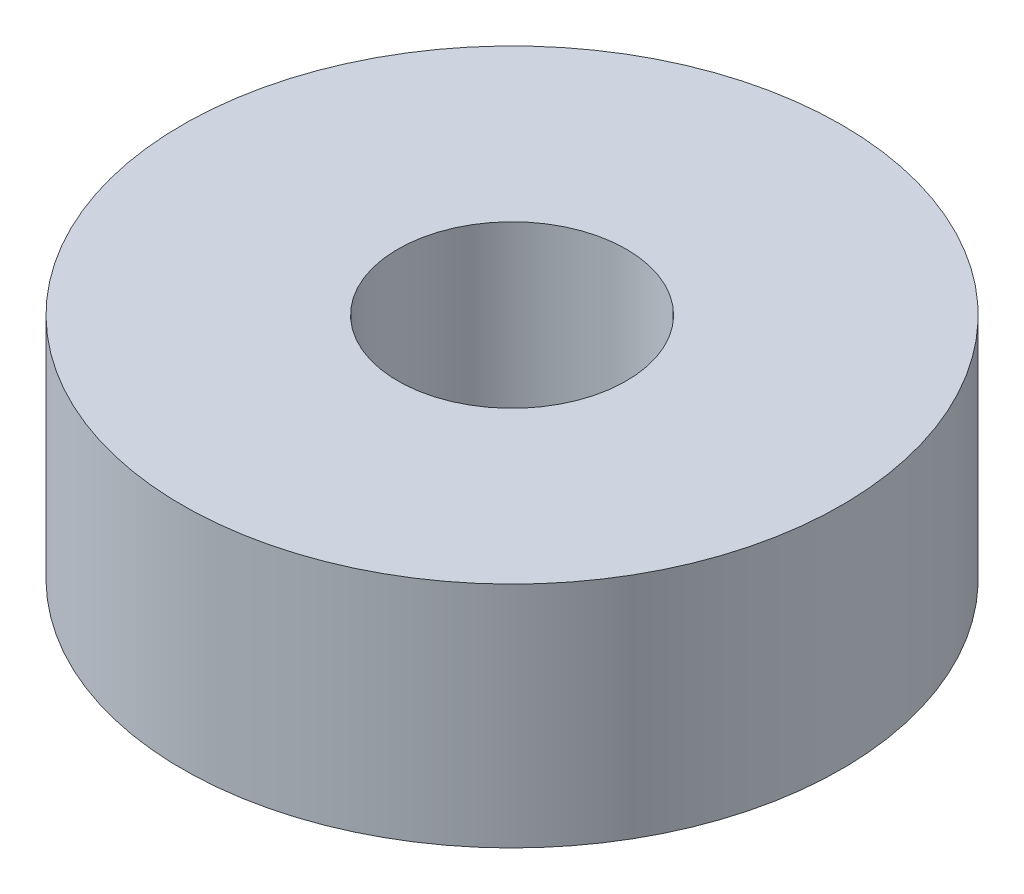
ISO-10303-21;
HEADER;
FILE_DESCRIPTION(('STEP AP214'),'2;1');
FILE_NAME('part.step','',(''),(''),'','','');
FILE_SCHEMA(('AUTOMOTIVE_DESIGN { 1 0 10303 214 1 1 1 1 }'));
ENDSEC;
DATA;
#1=APPLICATION_CONTEXT('core data for automotive mechanical design processes');
#2=APPLICATION_PROTOCOL_DEFINITION('international standard','automotive_design',2000,#1);
#3=PRODUCT_CONTEXT('',#1,'mechanical');
#4=PRODUCT('Part','Part','',(#3));
#5=PRODUCT_RELATED_PRODUCT_CATEGORY('part','',(#4));
#6=PRODUCT_DEFINITION_FORMATION('','',#4);
#7=PRODUCT_DEFINITION_CONTEXT('part definition',#1,'design');
#8=PRODUCT_DEFINITION('design','',#6,#7);
#9=PRODUCT_DEFINITION_SHAPE('','',#8);
#10=(LENGTH_UNIT() NAMED_UNIT(*) SI_UNIT(.MILLI.,.METRE.));
#11=(NAMED_UNIT(*) PLANE_ANGLE_UNIT() SI_UNIT($,.RADIAN.));
#12=(NAMED_UNIT(*) SI_UNIT($,.STERADIAN.) SOLID_ANGLE_UNIT());
#13=UNCERTAINTY_MEASURE_WITH_UNIT(LENGTH_MEASURE(1.E-05),#10,'distance_accuracy_value','');
#14=(GEOMETRIC_REPRESENTATION_CONTEXT(3) GLOBAL_UNCERTAINTY_ASSIGNED_CONTEXT((#13)) GLOBAL_UNIT_ASSIGNED_CONTEXT((#10,
#11,#12)) REPRESENTATION_CONTEXT('',''));
#15=CARTESIAN_POINT('',(0.,0.,0.));
#16=DIRECTION('',(0.,0.,1.));
#17=DIRECTION('',(1.,0.,0.));
#18=AXIS2_PLACEMENT_3D('',#15,#16,#17);
#19=CARTESIAN_POINT('',(0.,6.604,0.));
#20=DIRECTION('',(0.,1.,0.));
#21=DIRECTION('',(0.,0.,1.));
#22=AXIS2_PLACEMENT_3D('',#19,#20,#21);
#23=PLANE('',#22);
#24=CARTESIAN_POINT('',(0.,6.604,0.));
#25=DIRECTION('',(0.,1.,0.));
#26=DIRECTION('',(0.,0.,1.));
#27=AXIS2_PLACEMENT_3D('',#24,#25,#26);
#28=CIRCLE('',#27,9.525);
#29=CARTESIAN_POINT('',(0.,6.604,-9.525));
#30=VERTEX_POINT('',#29);
#31=EDGE_CURVE('E10',#30,#30,#28,.T.);
#32=ORIENTED_EDGE('',*,*,#31,.T.);
#33=EDGE_LOOP('',(#32));
#34=FACE_BOUND('',#33,.T.);
#35=CARTESIAN_POINT('',(0.,6.604,0.));
#36=DIRECTION('',(0.,1.,0.));
#37=DIRECTION('',(0.,0.,1.));
#38=AXIS2_PLACEMENT_3D('',#35,#36,#37);
#39=CIRCLE('',#38,3.302);
#40=CARTESIAN_POINT('',(0.,6.604,-3.302));
#41=VERTEX_POINT('',#40);
#42=EDGE_CURVE('E56',#41,#41,#39,.T.);
#43=ORIENTED_EDGE('',*,*,#42,.F.);
#44=EDGE_LOOP('',(#43));
#45=FACE_BOUND('',#44,.T.);
#46=ADVANCED_FACE('F43',(#34,#45),#23,.T.);
#47=CARTESIAN_POINT('',(0.,0.,0.));
#48=DIRECTION('',(0.,1.,0.));
#49=DIRECTION('',(0.,0.,1.));
#50=AXIS2_PLACEMENT_3D('',#47,#48,#49);
#51=PLANE('',#50);
#52=CARTESIAN_POINT('',(0.,0.,0.));
#53=DIRECTION('',(0.,1.,0.));
#54=DIRECTION('',(0.,0.,1.));
#55=AXIS2_PLACEMENT_3D('',#52,#53,#54);
#56=CIRCLE('',#55,9.525);
#57=CARTESIAN_POINT('',(0.,0.,-9.525));
#58=VERTEX_POINT('',#57);
#59=EDGE_CURVE('E47',#58,#58,#56,.T.);
#60=ORIENTED_EDGE('',*,*,#59,.F.);
#61=EDGE_LOOP('',(#60));
#62=FACE_BOUND('',#61,.T.);
#63=CARTESIAN_POINT('',(0.,0.,0.));
#64=DIRECTION('',(0.,1.,0.));
#65=DIRECTION('',(0.,0.,1.));
#66=AXIS2_PLACEMENT_3D('',#63,#64,#65);
#67=CIRCLE('',#66,3.302);
#68=CARTESIAN_POINT('',(0.,0.,-3.302));
#69=VERTEX_POINT('',#68);
#70=EDGE_CURVE('E58',#69,#69,#67,.T.);
#71=ORIENTED_EDGE('',*,*,#70,.T.);
#72=EDGE_LOOP('',(#71));
#73=FACE_BOUND('',#72,.T.);
#74=ADVANCED_FACE('F70',(#62,#73),#51,.F.);
#75=CARTESIAN_POINT('',(0.,6.604,0.));
#76=DIRECTION('',(0.,-1.,0.));
#77=DIRECTION('',(0.,0.,-1.));
#78=AXIS2_PLACEMENT_3D('',#75,#76,#77);
#79=CYLINDRICAL_SURFACE('',#78,9.525);
#80=CARTESIAN_POINT('',(0.,6.604,-9.525));
#81=CARTESIAN_POINT('',(0.,6.53520833333333,-9.525));
#82=CARTESIAN_POINT('',(0.,6.46641666666667,-9.525));
#83=CARTESIAN_POINT('',(0.,6.32883333333333,-9.525));
#84=CARTESIAN_POINT('',(0.,6.26004166666667,-9.525));
#85=CARTESIAN_POINT('',(0.,6.12245833333333,-9.525));
#86=CARTESIAN_POINT('',(0.,6.05366666666667,-9.525));
#87=CARTESIAN_POINT('',(0.,5.91608333333333,-9.525));
#88=CARTESIAN_POINT('',(0.,5.84729166666667,-9.525));
#89=CARTESIAN_POINT('',(0.,5.70970833333333,-9.525));
#90=CARTESIAN_POINT('',(0.,5.64091666666667,-9.525));
#91=CARTESIAN_POINT('',(0.,5.50333333333333,-9.525));
#92=CARTESIAN_POINT('',(0.,5.43454166666667,-9.525));
#93=CARTESIAN_POINT('',(0.,5.29695833333333,-9.525));
#94=CARTESIAN_POINT('',(0.,5.22816666666667,-9.525));
#95=CARTESIAN_POINT('',(0.,5.09058333333333,-9.525));
#96=CARTESIAN_POINT('',(0.,5.02179166666667,-9.525));
#97=CARTESIAN_POINT('',(0.,4.88420833333333,-9.525));
#98=CARTESIAN_POINT('',(0.,4.81541666666667,-9.525));
#99=CARTESIAN_POINT('',(0.,4.67783333333333,-9.525));
#100=CARTESIAN_POINT('',(0.,4.60904166666667,-9.525));
#101=CARTESIAN_POINT('',(0.,4.47145833333333,-9.525));
#102=CARTESIAN_POINT('',(0.,4.40266666666667,-9.525));
#103=CARTESIAN_POINT('',(0.,4.26508333333333,-9.525));
#104=CARTESIAN_POINT('',(0.,4.19629166666667,-9.525));
#105=CARTESIAN_POINT('',(0.,4.05870833333333,-9.525));
#106=CARTESIAN_POINT('',(0.,3.98991666666667,-9.525));
#107=CARTESIAN_POINT('',(0.,3.85233333333333,-9.525));
#108=CARTESIAN_POINT('',(0.,3.78354166666667,-9.525));
#109=CARTESIAN_POINT('',(0.,3.64595833333333,-9.525));
#110=CARTESIAN_POINT('',(0.,3.57716666666667,-9.525));
#111=CARTESIAN_POINT('',(0.,3.43958333333333,-9.525));
#112=CARTESIAN_POINT('',(0.,3.37079166666667,-9.525));
#113=CARTESIAN_POINT('',(0.,3.23320833333333,-9.525));
#114=CARTESIAN_POINT('',(0.,3.16441666666667,-9.525));
#115=CARTESIAN_POINT('',(0.,3.02683333333333,-9.525));
#116=CARTESIAN_POINT('',(0.,2.95804166666667,-9.525));
#117=CARTESIAN_POINT('',(0.,2.82045833333333,-9.525));
#118=CARTESIAN_POINT('',(0.,2.75166666666667,-9.525));
#119=CARTESIAN_POINT('',(0.,2.61408333333333,-9.525));
#120=CARTESIAN_POINT('',(0.,2.54529166666667,-9.525));
#121=CARTESIAN_POINT('',(0.,2.40770833333333,-9.525));
#122=CARTESIAN_POINT('',(0.,2.33891666666667,-9.525));
#123=CARTESIAN_POINT('',(0.,2.20133333333333,-9.525));
#124=CARTESIAN_POINT('',(0.,2.13254166666667,-9.525));
#125=CARTESIAN_POINT('',(0.,1.99495833333333,-9.525));
#126=CARTESIAN_POINT('',(0.,1.92616666666667,-9.525));
#127=CARTESIAN_POINT('',(0.,1.78858333333333,-9.525));
#128=CARTESIAN_POINT('',(0.,1.71979166666667,-9.525));
#129=CARTESIAN_POINT('',(0.,1.58220833333333,-9.525));
#130=CARTESIAN_POINT('',(0.,1.51341666666667,-9.525));
#131=CARTESIAN_POINT('',(0.,1.37583333333333,-9.525));
#132=CARTESIAN_POINT('',(0.,1.30704166666667,-9.525));
#133=CARTESIAN_POINT('',(0.,1.16945833333333,-9.525));
#134=CARTESIAN_POINT('',(0.,1.10066666666667,-9.525));
#135=CARTESIAN_POINT('',(0.,0.963083333333333,-9.525));
#136=CARTESIAN_POINT('',(0.,0.894291666666666,-9.525));
#137=CARTESIAN_POINT('',(0.,0.756708333333333,-9.525));
#138=CARTESIAN_POINT('',(0.,0.687916666666667,-9.525));
#139=CARTESIAN_POINT('',(0.,0.550333333333333,-9.525));
#140=CARTESIAN_POINT('',(0.,0.481541666666667,-9.525));
#141=CARTESIAN_POINT('',(0.,0.343958333333333,-9.525));
#142=CARTESIAN_POINT('',(0.,0.275166666666667,-9.525));
#143=CARTESIAN_POINT('',(0.,0.137583333333333,-9.525));
#144=CARTESIAN_POINT('',(0.,0.0687916666666666,-9.525));
#145=CARTESIAN_POINT('',(0.,0.,-9.525));
#146=B_SPLINE_CURVE_WITH_KNOTS('',3,(#80,#81,#82,#83,#84,#85,#86,#87,#88,#89,#90,#91,#92,#93,
#94,#95,#96,#97,#98,#99,#100,#101,#102,#103,#104,#105,#106,#107,#108,#109,#110,#111,#112,#113,
#114,#115,#116,#117,#118,#119,#120,#121,#122,#123,#124,#125,#126,#127,#128,#129,#130,#131,#132,
#133,#134,#135,#136,#137,#138,#139,#140,#141,#142,#143,#144,#145),.UNSPECIFIED.,.F.,.F.,(4,2,2,
2,2,2,2,2,2,2,2,2,2,2,2,2,2,2,2,2,2,2,2,2,2,2,2,2,2,2,2,2,4),(0.,0.206375000000001,
0.412750000000001,0.619125000000001,0.825500000000001,1.031875,1.23825,1.444625,1.651,1.857375,
2.06375,2.270125,2.4765,2.682875,2.88925,3.095625,3.302,3.508375,3.71475,3.921125,4.1275,
4.333875,4.54025,4.746625,4.953,5.159375,5.36575,5.572125,5.7785,5.984875,6.19125,6.397625,
6.604),.UNSPECIFIED.);
#147=EDGE_CURVE('BSEAM45',#30,#58,#146,.T.);
#148=ORIENTED_EDGE('',*,*,#31,.F.);
#149=ORIENTED_EDGE('',*,*,#59,.T.);
#150=ORIENTED_EDGE('',*,*,#147,.T.);
#151=ORIENTED_EDGE('',*,*,#147,.F.);
#152=EDGE_LOOP('',(#148,#150,#149,#151));
#153=FACE_BOUND('',#152,.T.);
#154=ADVANCED_FACE('F45',(#153),#79,.T.);
#155=CARTESIAN_POINT('',(0.,6.604,0.));
#156=DIRECTION('',(0.,-1.,0.));
#157=DIRECTION('',(0.,0.,-1.));
#158=AXIS2_PLACEMENT_3D('',#155,#156,#157);
#159=CYLINDRICAL_SURFACE('',#158,3.302);
#160=CARTESIAN_POINT('',(0.,6.604,-3.302));
#161=CARTESIAN_POINT('',(0.,6.53520833333333,-3.302));
#162=CARTESIAN_POINT('',(0.,6.46641666666667,-3.302));
#163=CARTESIAN_POINT('',(0.,6.32883333333333,-3.302));
#164=CARTESIAN_POINT('',(0.,6.26004166666667,-3.302));
#165=CARTESIAN_POINT('',(0.,6.12245833333333,-3.302));
#166=CARTESIAN_POINT('',(0.,6.05366666666667,-3.302));
#167=CARTESIAN_POINT('',(0.,5.91608333333333,-3.302));
#168=CARTESIAN_POINT('',(0.,5.84729166666667,-3.302));
#169=CARTESIAN_POINT('',(0.,5.70970833333333,-3.302));
#170=CARTESIAN_POINT('',(0.,5.64091666666667,-3.302));
#171=CARTESIAN_POINT('',(0.,5.50333333333333,-3.302));
#172=CARTESIAN_POINT('',(0.,5.43454166666667,-3.302));
#173=CARTESIAN_POINT('',(0.,5.29695833333333,-3.302));
#174=CARTESIAN_POINT('',(0.,5.22816666666667,-3.302));
#175=CARTESIAN_POINT('',(0.,5.09058333333333,-3.302));
#176=CARTESIAN_POINT('',(0.,5.02179166666667,-3.302));
#177=CARTESIAN_POINT('',(0.,4.88420833333333,-3.302));
#178=CARTESIAN_POINT('',(0.,4.81541666666667,-3.302));
#179=CARTESIAN_POINT('',(0.,4.67783333333333,-3.302));
#180=CARTESIAN_POINT('',(0.,4.60904166666667,-3.302));
#181=CARTESIAN_POINT('',(0.,4.47145833333333,-3.302));
#182=CARTESIAN_POINT('',(0.,4.40266666666667,-3.302));
#183=CARTESIAN_POINT('',(0.,4.26508333333333,-3.302));
#184=CARTESIAN_POINT('',(0.,4.19629166666667,-3.302));
#185=CARTESIAN_POINT('',(0.,4.05870833333333,-3.302));
#186=CARTESIAN_POINT('',(0.,3.98991666666667,-3.302));
#187=CARTESIAN_POINT('',(0.,3.85233333333333,-3.302));
#188=CARTESIAN_POINT('',(0.,3.78354166666667,-3.302));
#189=CARTESIAN_POINT('',(0.,3.64595833333333,-3.302));
#190=CARTESIAN_POINT('',(0.,3.57716666666667,-3.302));
#191=CARTESIAN_POINT('',(0.,3.43958333333333,-3.302));
#192=CARTESIAN_POINT('',(0.,3.37079166666667,-3.302));
#193=CARTESIAN_POINT('',(0.,3.23320833333333,-3.302));
#194=CARTESIAN_POINT('',(0.,3.16441666666667,-3.302));
#195=CARTESIAN_POINT('',(0.,3.02683333333333,-3.302));
#196=CARTESIAN_POINT('',(0.,2.95804166666667,-3.302));
#197=CARTESIAN_POINT('',(0.,2.82045833333333,-3.302));
#198=CARTESIAN_POINT('',(0.,2.75166666666667,-3.302));
#199=CARTESIAN_POINT('',(0.,2.61408333333333,-3.302));
#200=CARTESIAN_POINT('',(0.,2.54529166666667,-3.302));
#201=CARTESIAN_POINT('',(0.,2.40770833333333,-3.302));
#202=CARTESIAN_POINT('',(0.,2.33891666666667,-3.302));
#203=CARTESIAN_POINT('',(0.,2.20133333333333,-3.302));
#204=CARTESIAN_POINT('',(0.,2.13254166666667,-3.302));
#205=CARTESIAN_POINT('',(0.,1.99495833333333,-3.302));
#206=CARTESIAN_POINT('',(0.,1.92616666666667,-3.302));
#207=CARTESIAN_POINT('',(0.,1.78858333333333,-3.302));
#208=CARTESIAN_POINT('',(0.,1.71979166666667,-3.302));
#209=CARTESIAN_POINT('',(0.,1.58220833333333,-3.302));
#210=CARTESIAN_POINT('',(0.,1.51341666666667,-3.302));
#211=CARTESIAN_POINT('',(0.,1.37583333333333,-3.302));
#212=CARTESIAN_POINT('',(0.,1.30704166666667,-3.302));
#213=CARTESIAN_POINT('',(0.,1.16945833333333,-3.302));
#214=CARTESIAN_POINT('',(0.,1.10066666666667,-3.302));
#215=CARTESIAN_POINT('',(0.,0.963083333333333,-3.302));
#216=CARTESIAN_POINT('',(0.,0.894291666666666,-3.302));
#217=CARTESIAN_POINT('',(0.,0.756708333333333,-3.302));
#218=CARTESIAN_POINT('',(0.,0.687916666666667,-3.302));
#219=CARTESIAN_POINT('',(0.,0.550333333333333,-3.302));
#220=CARTESIAN_POINT('',(0.,0.481541666666667,-3.302));
#221=CARTESIAN_POINT('',(0.,0.343958333333333,-3.302));
#222=CARTESIAN_POINT('',(0.,0.275166666666667,-3.302));
#223=CARTESIAN_POINT('',(0.,0.137583333333333,-3.302));
#224=CARTESIAN_POINT('',(0.,0.0687916666666666,-3.302));
#225=CARTESIAN_POINT('',(0.,0.,-3.302));
#226=B_SPLINE_CURVE_WITH_KNOTS('',3,(#160,#161,#162,#163,#164,#165,#166,#167,#168,#169,#170,
#171,#172,#173,#174,#175,#176,#177,#178,#179,#180,#181,#182,#183,#184,#185,#186,#187,#188,#189,
#190,#191,#192,#193,#194,#195,#196,#197,#198,#199,#200,#201,#202,#203,#204,#205,#206,#207,#208,
#209,#210,#211,#212,#213,#214,#215,#216,#217,#218,#219,#220,#221,#222,#223,#224,#225),
.UNSPECIFIED.,.F.,.F.,(4,2,2,2,2,2,2,2,2,2,2,2,2,2,2,2,2,2,2,2,2,2,2,2,2,2,2,2,2,2,2,2,4),(0.,
0.206375000000001,0.412750000000001,0.619125000000001,0.825500000000001,1.031875,1.23825,
1.444625,1.651,1.857375,2.06375,2.270125,2.4765,2.682875,2.88925,3.095625,3.302,3.508375,
3.71475,3.921125,4.1275,4.333875,4.54025,4.746625,4.953,5.159375,5.36575,5.572125,5.7785,
5.984875,6.19125,6.397625,6.604),.UNSPECIFIED.);
#227=EDGE_CURVE('BSEAM66',#41,#69,#226,.T.);
#228=ORIENTED_EDGE('',*,*,#42,.T.);
#229=ORIENTED_EDGE('',*,*,#70,.F.);
#230=ORIENTED_EDGE('',*,*,#227,.T.);
#231=ORIENTED_EDGE('',*,*,#227,.F.);
#232=EDGE_LOOP('',(#228,#230,#229,#231));
#233=FACE_BOUND('',#232,.T.);
#234=ADVANCED_FACE('F66',(#233),#159,.F.);
#235=CLOSED_SHELL('',(#46,#74,#154,#234));
#236=MANIFOLD_SOLID_BREP('B2',#235);
#237=ADVANCED_BREP_SHAPE_REPRESENTATION('',(#18,#236),#14);
#238=SHAPE_DEFINITION_REPRESENTATION(#9,#237);
ENDSEC;
END-ISO-10303-21;
